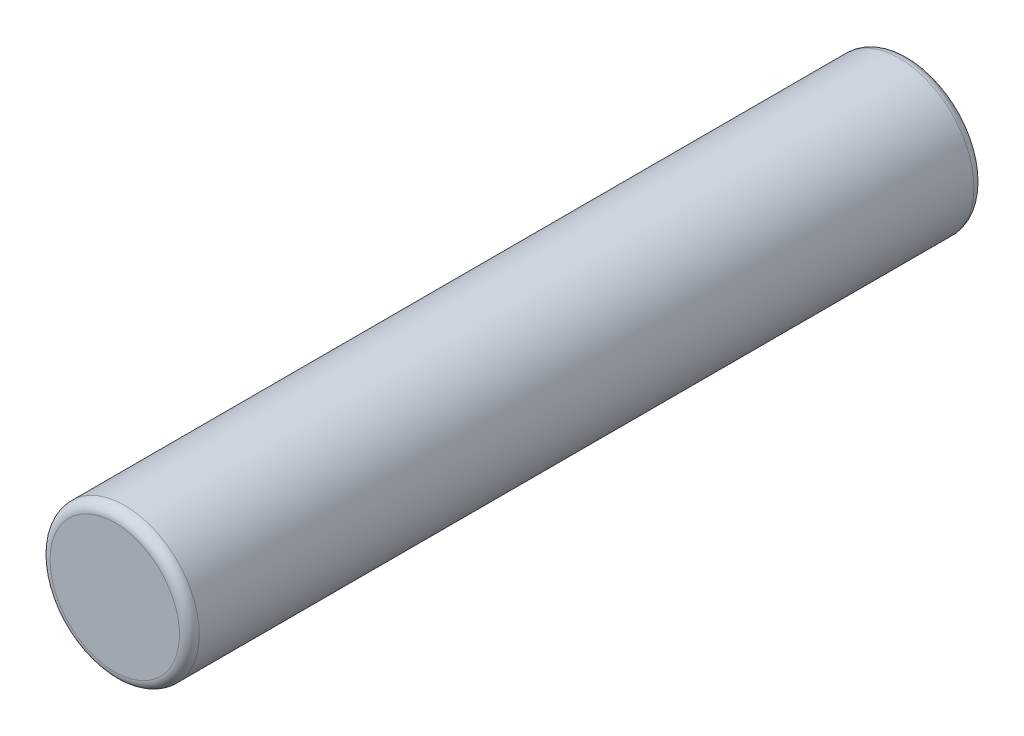
ISO-10303-21;
HEADER;
FILE_DESCRIPTION(('STEP AP214'),'2;1');
FILE_NAME('part.step','',(''),(''),'','','');
FILE_SCHEMA(('AUTOMOTIVE_DESIGN { 1 0 10303 214 1 1 1 1 }'));
ENDSEC;
DATA;
#1=APPLICATION_CONTEXT('core data for automotive mechanical design processes');
#2=APPLICATION_PROTOCOL_DEFINITION('international standard','automotive_design',2000,#1);
#3=PRODUCT_CONTEXT('',#1,'mechanical');
#4=PRODUCT('Part','Part','',(#3));
#5=PRODUCT_RELATED_PRODUCT_CATEGORY('part','',(#4));
#6=PRODUCT_DEFINITION_FORMATION('','',#4);
#7=PRODUCT_DEFINITION_CONTEXT('part definition',#1,'design');
#8=PRODUCT_DEFINITION('design','',#6,#7);
#9=PRODUCT_DEFINITION_SHAPE('','',#8);
#10=(LENGTH_UNIT() NAMED_UNIT(*) SI_UNIT(.MILLI.,.METRE.));
#11=(NAMED_UNIT(*) PLANE_ANGLE_UNIT() SI_UNIT($,.RADIAN.));
#12=(NAMED_UNIT(*) SI_UNIT($,.STERADIAN.) SOLID_ANGLE_UNIT());
#13=UNCERTAINTY_MEASURE_WITH_UNIT(LENGTH_MEASURE(1.E-05),#10,'distance_accuracy_value','');
#14=(GEOMETRIC_REPRESENTATION_CONTEXT(3) GLOBAL_UNCERTAINTY_ASSIGNED_CONTEXT((#13)) GLOBAL_UNIT_ASSIGNED_CONTEXT((#10,
#11,#12)) REPRESENTATION_CONTEXT('',''));
#15=CARTESIAN_POINT('',(0.,0.,0.));
#16=DIRECTION('',(0.,0.,1.));
#17=DIRECTION('',(1.,0.,0.));
#18=AXIS2_PLACEMENT_3D('',#15,#16,#17);
#19=CARTESIAN_POINT('',(0.,0.,0.));
#20=DIRECTION('',(0.,0.,-1.));
#21=DIRECTION('',(-1.,0.,0.));
#22=AXIS2_PLACEMENT_3D('',#19,#20,#21);
#23=PLANE('',#22);
#24=CARTESIAN_POINT('',(0.,0.,0.));
#25=DIRECTION('',(0.,0.,-1.));
#26=DIRECTION('',(-1.,0.,0.));
#27=AXIS2_PLACEMENT_3D('',#24,#25,#26);
#28=CIRCLE('',#27,1.3025);
#29=CARTESIAN_POINT('',(-1.3025,0.,0.));
#30=VERTEX_POINT('',#29);
#31=EDGE_CURVE('E47',#30,#30,#28,.F.);
#32=ORIENTED_EDGE('',*,*,#31,.T.);
#33=EDGE_LOOP('',(#32));
#34=FACE_BOUND('',#33,.T.);
#35=ADVANCED_FACE('F39',(#34),#23,.F.);
#36=CARTESIAN_POINT('',(0.,0.,0.));
#37=DIRECTION('',(0.,0.,1.));
#38=DIRECTION('',(1.,0.,0.));
#39=AXIS2_PLACEMENT_3D('',#36,#37,#38);
#40=CYLINDRICAL_SURFACE('',#39,1.5025);
#41=CARTESIAN_POINT('',(0.,0.,-0.2));
#42=DIRECTION('',(0.,0.,-1.));
#43=DIRECTION('',(-1.,0.,0.));
#44=AXIS2_PLACEMENT_3D('',#41,#42,#43);
#45=CIRCLE('',#44,1.5025);
#46=CARTESIAN_POINT('',(-1.5025,0.,-0.2));
#47=VERTEX_POINT('',#46);
#48=EDGE_CURVE('E10',#47,#47,#45,.T.);
#49=ORIENTED_EDGE('',*,*,#48,.T.);
#50=EDGE_LOOP('',(#49));
#51=FACE_BOUND('',#50,.T.);
#52=CARTESIAN_POINT('',(0.,0.,-15.8));
#53=DIRECTION('',(0.,0.,1.));
#54=DIRECTION('',(1.,0.,0.));
#55=AXIS2_PLACEMENT_3D('',#52,#53,#54);
#56=CIRCLE('',#55,1.5025);
#57=CARTESIAN_POINT('',(1.5025,0.,-15.8));
#58=VERTEX_POINT('',#57);
#59=EDGE_CURVE('E57',#58,#58,#56,.T.);
#60=ORIENTED_EDGE('',*,*,#59,.T.);
#61=EDGE_LOOP('',(#60));
#62=FACE_BOUND('',#61,.T.);
#63=ADVANCED_FACE('F64',(#51,#62),#40,.T.);
#64=CARTESIAN_POINT('',(0.,1.5025,-16.));
#65=DIRECTION('',(0.,0.,1.));
#66=DIRECTION('',(1.,0.,0.));
#67=AXIS2_PLACEMENT_3D('',#64,#65,#66);
#68=PLANE('',#67);
#69=CARTESIAN_POINT('',(0.,0.,-16.));
#70=DIRECTION('',(0.,0.,1.));
#71=DIRECTION('',(1.,0.,0.));
#72=AXIS2_PLACEMENT_3D('',#69,#70,#71);
#73=CIRCLE('',#72,1.3025);
#74=CARTESIAN_POINT('',(1.3025,0.,-16.));
#75=VERTEX_POINT('',#74);
#76=EDGE_CURVE('E52',#75,#75,#73,.F.);
#77=ORIENTED_EDGE('',*,*,#76,.T.);
#78=EDGE_LOOP('',(#77));
#79=FACE_BOUND('',#78,.T.);
#80=ADVANCED_FACE('F68',(#79),#68,.F.);
#81=CARTESIAN_POINT('',(0.,0.,-15.8));
#82=DIRECTION('',(0.,0.,1.));
#83=DIRECTION('',(1.,0.,0.));
#84=AXIS2_PLACEMENT_3D('',#81,#82,#83);
#85=TOROIDAL_SURFACE('',#84,1.3025,0.2);
#86=ORIENTED_EDGE('',*,*,#76,.F.);
#87=EDGE_LOOP('',(#86));
#88=FACE_BOUND('',#87,.T.);
#89=ORIENTED_EDGE('',*,*,#59,.F.);
#90=EDGE_LOOP('',(#89));
#91=FACE_BOUND('',#90,.T.);
#92=ADVANCED_FACE('F66',(#88,#91),#85,.T.);
#93=CARTESIAN_POINT('',(0.,0.,-0.2));
#94=DIRECTION('',(0.,0.,-1.));
#95=DIRECTION('',(-1.,0.,0.));
#96=AXIS2_PLACEMENT_3D('',#93,#94,#95);
#97=TOROIDAL_SURFACE('',#96,1.3025,0.2);
#98=ORIENTED_EDGE('',*,*,#48,.F.);
#99=EDGE_LOOP('',(#98));
#100=FACE_BOUND('',#99,.T.);
#101=ORIENTED_EDGE('',*,*,#31,.F.);
#102=EDGE_LOOP('',(#101));
#103=FACE_BOUND('',#102,.T.);
#104=ADVANCED_FACE('F41',(#100,#103),#97,.T.);
#105=CLOSED_SHELL('',(#35,#63,#80,#92,#104));
#106=MANIFOLD_SOLID_BREP('B2',#105);
#107=ADVANCED_BREP_SHAPE_REPRESENTATION('',(#18,#106),#14);
#108=SHAPE_DEFINITION_REPRESENTATION(#9,#107);
ENDSEC;
END-ISO-10303-21;
